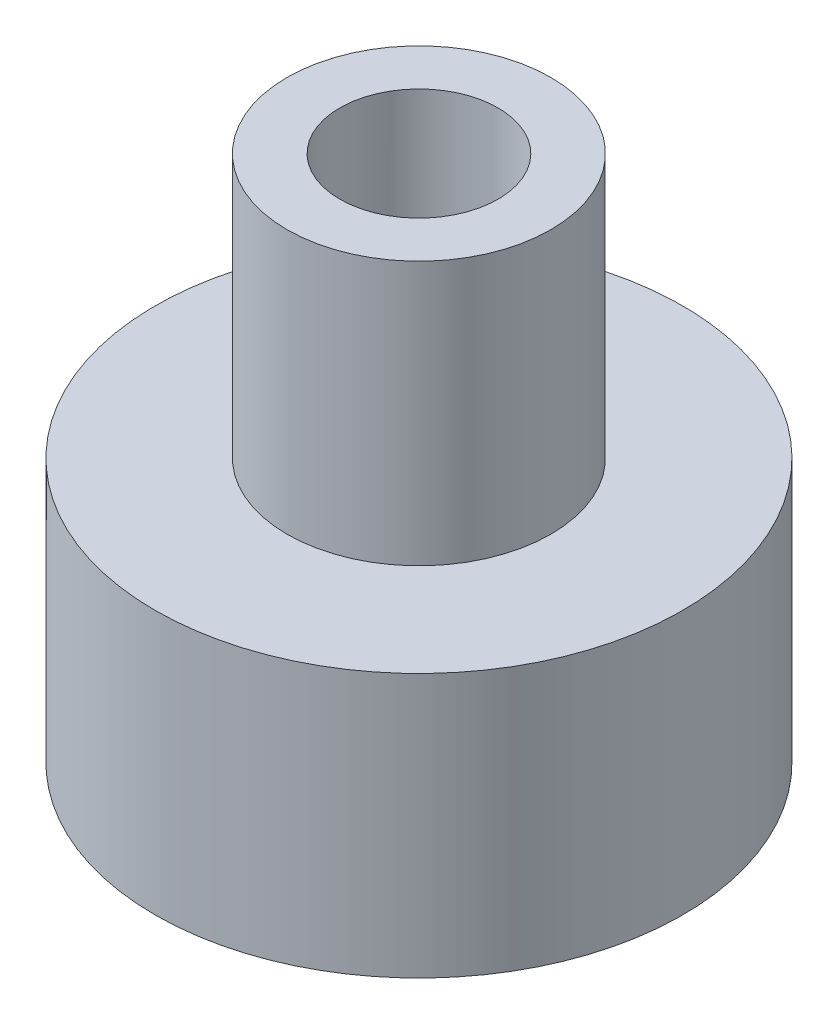
ISO-10303-21;
HEADER;
FILE_DESCRIPTION(('STEP AP214'),'2;1');
FILE_NAME('part.step','',(''),(''),'','','');
FILE_SCHEMA(('AUTOMOTIVE_DESIGN { 1 0 10303 214 1 1 1 1 }'));
ENDSEC;
DATA;
#1=APPLICATION_CONTEXT('core data for automotive mechanical design processes');
#2=APPLICATION_PROTOCOL_DEFINITION('international standard','automotive_design',2000,#1);
#3=PRODUCT_CONTEXT('',#1,'mechanical');
#4=PRODUCT('Part','Part','',(#3));
#5=PRODUCT_RELATED_PRODUCT_CATEGORY('part','',(#4));
#6=PRODUCT_DEFINITION_FORMATION('','',#4);
#7=PRODUCT_DEFINITION_CONTEXT('part definition',#1,'design');
#8=PRODUCT_DEFINITION('design','',#6,#7);
#9=PRODUCT_DEFINITION_SHAPE('','',#8);
#10=(LENGTH_UNIT() NAMED_UNIT(*) SI_UNIT(.MILLI.,.METRE.));
#11=(NAMED_UNIT(*) PLANE_ANGLE_UNIT() SI_UNIT($,.RADIAN.));
#12=(NAMED_UNIT(*) SI_UNIT($,.STERADIAN.) SOLID_ANGLE_UNIT());
#13=UNCERTAINTY_MEASURE_WITH_UNIT(LENGTH_MEASURE(1.E-05),#10,'distance_accuracy_value','');
#14=(GEOMETRIC_REPRESENTATION_CONTEXT(3) GLOBAL_UNCERTAINTY_ASSIGNED_CONTEXT((#13)) GLOBAL_UNIT_ASSIGNED_CONTEXT((#10,
#11,#12)) REPRESENTATION_CONTEXT('',''));
#15=CARTESIAN_POINT('',(0.,0.,0.));
#16=DIRECTION('',(0.,0.,1.));
#17=DIRECTION('',(1.,0.,0.));
#18=AXIS2_PLACEMENT_3D('',#15,#16,#17);
#19=CARTESIAN_POINT('',(0.,5.,0.));
#20=DIRECTION('',(0.,-1.,0.));
#21=DIRECTION('',(0.,0.,-1.));
#22=AXIS2_PLACEMENT_3D('',#19,#20,#21);
#23=CYLINDRICAL_SURFACE('',#22,5.);
#24=CARTESIAN_POINT('',(0.,5.,0.));
#25=DIRECTION('',(0.,1.,0.));
#26=DIRECTION('',(0.,0.,1.));
#27=AXIS2_PLACEMENT_3D('',#24,#25,#26);
#28=CIRCLE('',#27,5.);
#29=CARTESIAN_POINT('',(0.,5.,5.));
#30=VERTEX_POINT('',#29);
#31=EDGE_CURVE('E10',#30,#30,#28,.T.);
#32=ORIENTED_EDGE('',*,*,#31,.F.);
#33=EDGE_LOOP('',(#32));
#34=FACE_BOUND('',#33,.T.);
#35=CARTESIAN_POINT('',(0.,0.,0.));
#36=DIRECTION('',(0.,1.,0.));
#37=DIRECTION('',(0.,0.,1.));
#38=AXIS2_PLACEMENT_3D('',#35,#36,#37);
#39=CIRCLE('',#38,5.);
#40=CARTESIAN_POINT('',(0.,0.,5.));
#41=VERTEX_POINT('',#40);
#42=EDGE_CURVE('E33',#41,#41,#39,.T.);
#43=ORIENTED_EDGE('',*,*,#42,.T.);
#44=EDGE_LOOP('',(#43));
#45=FACE_BOUND('',#44,.T.);
#46=ADVANCED_FACE('F30',(#34,#45),#23,.T.);
#47=CARTESIAN_POINT('',(0.,5.,0.));
#48=DIRECTION('',(0.,1.,0.));
#49=DIRECTION('',(0.,0.,1.));
#50=AXIS2_PLACEMENT_3D('',#47,#48,#49);
#51=PLANE('',#50);
#52=CARTESIAN_POINT('',(0.,5.,0.));
#53=DIRECTION('',(0.,1.,0.));
#54=DIRECTION('',(0.,0.,1.));
#55=AXIS2_PLACEMENT_3D('',#52,#53,#54);
#56=CIRCLE('',#55,2.5);
#57=CARTESIAN_POINT('',(0.,5.,2.5));
#58=VERTEX_POINT('',#57);
#59=EDGE_CURVE('E42',#58,#58,#56,.T.);
#60=ORIENTED_EDGE('',*,*,#59,.F.);
#61=EDGE_LOOP('',(#60));
#62=FACE_BOUND('',#61,.T.);
#63=ORIENTED_EDGE('',*,*,#31,.T.);
#64=EDGE_LOOP('',(#63));
#65=FACE_BOUND('',#64,.T.);
#66=ADVANCED_FACE('F73',(#62,#65),#51,.T.);
#67=CARTESIAN_POINT('',(0.,0.,0.));
#68=DIRECTION('',(0.,1.,0.));
#69=DIRECTION('',(0.,0.,1.));
#70=AXIS2_PLACEMENT_3D('',#67,#68,#69);
#71=PLANE('',#70);
#72=CARTESIAN_POINT('',(0.,0.,0.));
#73=DIRECTION('',(0.,-1.,0.));
#74=DIRECTION('',(0.,0.,-1.));
#75=AXIS2_PLACEMENT_3D('',#72,#73,#74);
#76=CIRCLE('',#75,2.05);
#77=CARTESIAN_POINT('',(0.,0.,-2.05));
#78=VERTEX_POINT('',#77);
#79=EDGE_CURVE('E54',#78,#78,#76,.T.);
#80=ORIENTED_EDGE('',*,*,#79,.F.);
#81=EDGE_LOOP('',(#80));
#82=FACE_BOUND('',#81,.T.);
#83=ORIENTED_EDGE('',*,*,#42,.F.);
#84=EDGE_LOOP('',(#83));
#85=FACE_BOUND('',#84,.T.);
#86=ADVANCED_FACE('F69',(#82,#85),#71,.F.);
#87=CARTESIAN_POINT('',(0.,10.,0.));
#88=DIRECTION('',(0.,-1.,0.));
#89=DIRECTION('',(0.,0.,-1.));
#90=AXIS2_PLACEMENT_3D('',#87,#88,#89);
#91=CYLINDRICAL_SURFACE('',#90,2.5);
#92=CARTESIAN_POINT('',(0.,10.,0.));
#93=DIRECTION('',(0.,1.,0.));
#94=DIRECTION('',(0.,0.,1.));
#95=AXIS2_PLACEMENT_3D('',#92,#93,#94);
#96=CIRCLE('',#95,2.5);
#97=CARTESIAN_POINT('',(0.,10.,2.5));
#98=VERTEX_POINT('',#97);
#99=EDGE_CURVE('E40',#98,#98,#96,.T.);
#100=ORIENTED_EDGE('',*,*,#99,.F.);
#101=EDGE_LOOP('',(#100));
#102=FACE_BOUND('',#101,.T.);
#103=ORIENTED_EDGE('',*,*,#59,.T.);
#104=EDGE_LOOP('',(#103));
#105=FACE_BOUND('',#104,.T.);
#106=ADVANCED_FACE('F72',(#102,#105),#91,.T.);
#107=CARTESIAN_POINT('',(0.,10.,0.));
#108=DIRECTION('',(0.,1.,0.));
#109=DIRECTION('',(0.,0.,1.));
#110=AXIS2_PLACEMENT_3D('',#107,#108,#109);
#111=PLANE('',#110);
#112=CARTESIAN_POINT('',(0.,10.,0.));
#113=DIRECTION('',(0.,1.,0.));
#114=DIRECTION('',(0.,0.,1.));
#115=AXIS2_PLACEMENT_3D('',#112,#113,#114);
#116=CIRCLE('',#115,1.5);
#117=CARTESIAN_POINT('',(0.,10.,1.5));
#118=VERTEX_POINT('',#117);
#119=EDGE_CURVE('E45',#118,#118,#116,.T.);
#120=ORIENTED_EDGE('',*,*,#119,.F.);
#121=EDGE_LOOP('',(#120));
#122=FACE_BOUND('',#121,.T.);
#123=ORIENTED_EDGE('',*,*,#99,.T.);
#124=EDGE_LOOP('',(#123));
#125=FACE_BOUND('',#124,.T.);
#126=ADVANCED_FACE('F89',(#122,#125),#111,.T.);
#127=CARTESIAN_POINT('',(0.,5.,0.));
#128=DIRECTION('',(0.,1.,0.));
#129=DIRECTION('',(0.,0.,1.));
#130=AXIS2_PLACEMENT_3D('',#127,#128,#129);
#131=CYLINDRICAL_SURFACE('',#130,1.5);
#132=CARTESIAN_POINT('',(0.,5.,0.));
#133=DIRECTION('',(0.,-1.,0.));
#134=DIRECTION('',(0.,0.,-1.));
#135=AXIS2_PLACEMENT_3D('',#132,#133,#134);
#136=CIRCLE('',#135,1.5);
#137=CARTESIAN_POINT('',(0.,5.,-1.5));
#138=VERTEX_POINT('',#137);
#139=EDGE_CURVE('E50',#138,#138,#136,.F.);
#140=ORIENTED_EDGE('',*,*,#139,.F.);
#141=EDGE_LOOP('',(#140));
#142=FACE_BOUND('',#141,.T.);
#143=ORIENTED_EDGE('',*,*,#119,.T.);
#144=EDGE_LOOP('',(#143));
#145=FACE_BOUND('',#144,.T.);
#146=ADVANCED_FACE('F93',(#142,#145),#131,.F.);
#147=CARTESIAN_POINT('',(0.,5.,0.));
#148=DIRECTION('',(0.,-1.,0.));
#149=DIRECTION('',(0.,0.,-1.));
#150=AXIS2_PLACEMENT_3D('',#147,#148,#149);
#151=PLANE('',#150);
#152=CARTESIAN_POINT('',(0.,5.,0.));
#153=DIRECTION('',(0.,-1.,0.));
#154=DIRECTION('',(0.,0.,-1.));
#155=AXIS2_PLACEMENT_3D('',#152,#153,#154);
#156=CIRCLE('',#155,2.05);
#157=CARTESIAN_POINT('',(0.,5.,-2.05));
#158=VERTEX_POINT('',#157);
#159=EDGE_CURVE('E53',#158,#158,#156,.T.);
#160=ORIENTED_EDGE('',*,*,#159,.T.);
#161=EDGE_LOOP('',(#160));
#162=FACE_BOUND('',#161,.T.);
#163=ORIENTED_EDGE('',*,*,#139,.T.);
#164=EDGE_LOOP('',(#163));
#165=FACE_BOUND('',#164,.T.);
#166=ADVANCED_FACE('F60',(#162,#165),#151,.T.);
#167=CARTESIAN_POINT('',(0.,5.,0.));
#168=DIRECTION('',(0.,-1.,0.));
#169=DIRECTION('',(0.,0.,-1.));
#170=AXIS2_PLACEMENT_3D('',#167,#168,#169);
#171=CYLINDRICAL_SURFACE('',#170,2.05);
#172=ORIENTED_EDGE('',*,*,#159,.F.);
#173=EDGE_LOOP('',(#172));
#174=FACE_BOUND('',#173,.T.);
#175=ORIENTED_EDGE('',*,*,#79,.T.);
#176=EDGE_LOOP('',(#175));
#177=FACE_BOUND('',#176,.T.);
#178=ADVANCED_FACE('F63',(#174,#177),#171,.F.);
#179=CLOSED_SHELL('',(#46,#66,#86,#106,#126,#146,#166,#178));
#180=MANIFOLD_SOLID_BREP('B2',#179);
#181=ADVANCED_BREP_SHAPE_REPRESENTATION('',(#18,#180),#14);
#182=SHAPE_DEFINITION_REPRESENTATION(#9,#181);
ENDSEC;
END-ISO-10303-21;
